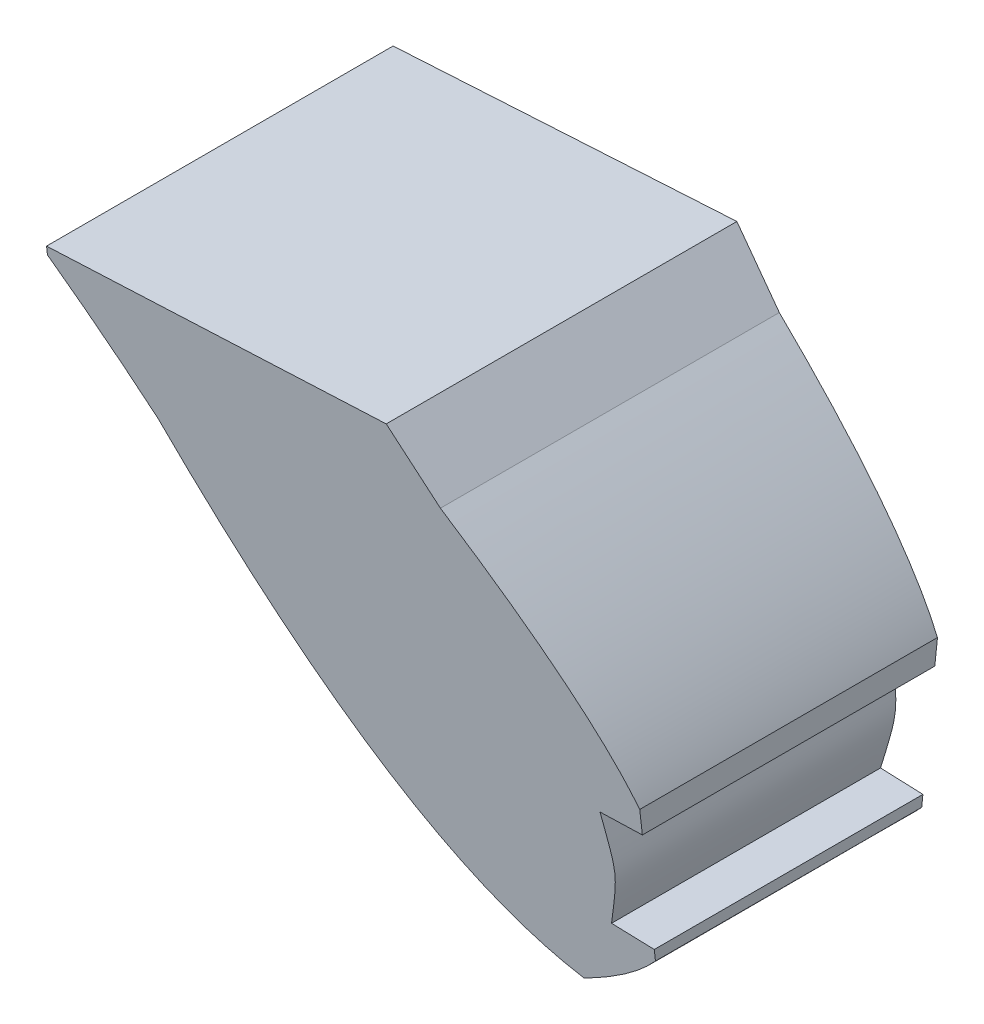
ISO-10303-21;
HEADER;
FILE_DESCRIPTION(('STEP AP214'),'2;1');
FILE_NAME('part.step','',(''),(''),'','','');
FILE_SCHEMA(('AUTOMOTIVE_DESIGN { 1 0 10303 214 1 1 1 1 }'));
ENDSEC;
DATA;
#1=APPLICATION_CONTEXT('core data for automotive mechanical design processes');
#2=APPLICATION_PROTOCOL_DEFINITION('international standard','automotive_design',2000,#1);
#3=PRODUCT_CONTEXT('',#1,'mechanical');
#4=PRODUCT('Part','Part','',(#3));
#5=PRODUCT_RELATED_PRODUCT_CATEGORY('part','',(#4));
#6=PRODUCT_DEFINITION_FORMATION('','',#4);
#7=PRODUCT_DEFINITION_CONTEXT('part definition',#1,'design');
#8=PRODUCT_DEFINITION('design','',#6,#7);
#9=PRODUCT_DEFINITION_SHAPE('','',#8);
#10=(LENGTH_UNIT() NAMED_UNIT(*) SI_UNIT(.MILLI.,.METRE.));
#11=(NAMED_UNIT(*) PLANE_ANGLE_UNIT() SI_UNIT($,.RADIAN.));
#12=(NAMED_UNIT(*) SI_UNIT($,.STERADIAN.) SOLID_ANGLE_UNIT());
#13=UNCERTAINTY_MEASURE_WITH_UNIT(LENGTH_MEASURE(1.E-05),#10,'distance_accuracy_value','');
#14=(GEOMETRIC_REPRESENTATION_CONTEXT(3) GLOBAL_UNCERTAINTY_ASSIGNED_CONTEXT((#13)) GLOBAL_UNIT_ASSIGNED_CONTEXT((#10,
#11,#12)) REPRESENTATION_CONTEXT('',''));
#15=CARTESIAN_POINT('',(0.,0.,0.));
#16=DIRECTION('',(0.,0.,1.));
#17=DIRECTION('',(1.,0.,0.));
#18=AXIS2_PLACEMENT_3D('',#15,#16,#17);
#19=CARTESIAN_POINT('',(0.355125000055651,-1.23774703808888E-13,7.21));
#20=DIRECTION('',(-1.,3.48538412642003E-13,0.));
#21=DIRECTION('',(-3.48538412642003E-13,-1.,0.));
#22=AXIS2_PLACEMENT_3D('',#19,#20,#21);
#23=PLANE('',#22);
#24=DIRECTION('',(0.,-0.993653373689782,0.112485434412262));
#25=VECTOR('',#24,1.);
#26=CARTESIAN_POINT('',(0.355125000056697,12.6081551722012,-7.21));
#27=LINE('',#26,#25);
#28=CARTESIAN_POINT('',(0.355125000056697,3.0015495286345,-6.12249480185305));
#29=VERTEX_POINT('',#28);
#30=CARTESIAN_POINT('',(0.355125000056447,2.03738091179555,-6.01334715682561));
#31=VERTEX_POINT('',#30);
#32=EDGE_CURVE('E58',#29,#31,#27,.T.);
#33=ORIENTED_EDGE('',*,*,#32,.F.);
#34=DIRECTION('',(0.,0.,-1.));
#35=VECTOR('',#34,1.);
#36=CARTESIAN_POINT('',(0.355125000056697,3.0015495286345,7.21));
#37=LINE('',#36,#35);
#38=CARTESIAN_POINT('',(0.355125000056697,3.0015495286345,6.12249480185305));
#39=VERTEX_POINT('',#38);
#40=EDGE_CURVE('E177',#39,#29,#37,.T.);
#41=ORIENTED_EDGE('',*,*,#40,.F.);
#42=DIRECTION('',(0.,0.993653373689782,0.112485434412263));
#43=VECTOR('',#42,1.);
#44=CARTESIAN_POINT('',(0.355125000056697,12.6081551722012,7.21));
#45=LINE('',#44,#43);
#46=CARTESIAN_POINT('',(0.355125000056697,2.03738091179556,6.01334715682562));
#47=VERTEX_POINT('',#46);
#48=EDGE_CURVE('E154',#47,#39,#45,.T.);
#49=ORIENTED_EDGE('',*,*,#48,.F.);
#50=DIRECTION('',(0.,0.,-1.));
#51=VECTOR('',#50,1.);
#52=CARTESIAN_POINT('',(0.355125000056447,2.03738091179555,7.21));
#53=LINE('',#52,#51);
#54=EDGE_CURVE('E171',#47,#31,#53,.T.);
#55=ORIENTED_EDGE('',*,*,#54,.T.);
#56=EDGE_LOOP('',(#33,#41,#49,#55));
#57=FACE_BOUND('',#56,.T.);
#58=ADVANCED_FACE('F43',(#57),#23,.F.);
#59=CARTESIAN_POINT('',(-23.0359211456035,0.,7.21));
#60=DIRECTION('',(-1.,0.,0.));
#61=DIRECTION('',(0.,0.,1.));
#62=AXIS2_PLACEMENT_3D('',#59,#60,#61);
#63=PLANE('',#62);
#64=DIRECTION('',(0.,0.,-1.));
#65=VECTOR('',#64,1.);
#66=CARTESIAN_POINT('',(-23.0359211456035,11.8716122879342,7.21));
#67=LINE('',#66,#65);
#68=CARTESIAN_POINT('',(-23.0359211456035,11.8716122879342,7.12662047501294));
#69=VERTEX_POINT('',#68);
#70=CARTESIAN_POINT('',(-23.0359211456035,11.8716122879342,-7.12662047501294));
#71=VERTEX_POINT('',#70);
#72=EDGE_CURVE('E188',#69,#71,#67,.T.);
#73=ORIENTED_EDGE('',*,*,#72,.T.);
#74=DIRECTION('',(0.,-0.993653373689782,0.112485434412262));
#75=VECTOR('',#74,1.);
#76=CARTESIAN_POINT('',(-23.0359211456035,12.6081551722012,-7.21));
#77=LINE('',#76,#75);
#78=CARTESIAN_POINT('',(-23.0359211456035,11.5401378200982,-7.08909627341673));
#79=VERTEX_POINT('',#78);
#80=EDGE_CURVE('E322',#71,#79,#77,.T.);
#81=ORIENTED_EDGE('',*,*,#80,.T.);
#82=DIRECTION('',(0.,0.,-1.));
#83=VECTOR('',#82,1.);
#84=CARTESIAN_POINT('',(-23.0359211456035,11.5401378200983,7.21));
#85=LINE('',#84,#83);
#86=CARTESIAN_POINT('',(-23.0359211456035,11.5401378200982,7.08909627341673));
#87=VERTEX_POINT('',#86);
#88=EDGE_CURVE('E194',#87,#79,#85,.T.);
#89=ORIENTED_EDGE('',*,*,#88,.F.);
#90=DIRECTION('',(0.,0.993653373689782,0.112485434412263));
#91=VECTOR('',#90,1.);
#92=CARTESIAN_POINT('',(-23.0359211456035,12.6081551722012,7.21));
#93=LINE('',#92,#91);
#94=EDGE_CURVE('E316',#87,#69,#93,.T.);
#95=ORIENTED_EDGE('',*,*,#94,.T.);
#96=EDGE_LOOP('',(#73,#81,#89,#95));
#97=FACE_BOUND('',#96,.T.);
#98=ADVANCED_FACE('F319',(#97),#63,.T.);
#99=CARTESIAN_POINT('',(-18.9451921135982,7.54091889574655,7.21));
#100=CARTESIAN_POINT('',(-10.2150083842792,-3.69764410322756,7.21));
#101=CARTESIAN_POINT('',(-2.84660482498738,-5.05908110388432,7.21));
#102=(BOUNDED_CURVE() B_SPLINE_CURVE(2,(#99,#100,#101),.UNSPECIFIED.,.F.,
.F.) B_SPLINE_CURVE_WITH_KNOTS((3,3),(0.497667241108509,0.499554279588011),
.UNSPECIFIED.) CURVE() GEOMETRIC_REPRESENTATION_ITEM() RATIONAL_B_SPLINE_CURVE((1.,1.,1.)) REPRESENTATION_ITEM(''));
#103=DIRECTION('',(0.,0.,-1.));
#104=VECTOR('',#103,1.);
#105=SURFACE_OF_LINEAR_EXTRUSION('',#102,#104);
#106=DIRECTION('',(0.,0.,-1.));
#107=VECTOR('',#106,1.);
#108=CARTESIAN_POINT('',(-18.9451921135982,7.54091889574657,7.21));
#109=LINE('',#108,#107);
#110=CARTESIAN_POINT('',(-18.9451921135982,7.54091889574657,6.63636910524442));
#111=VERTEX_POINT('',#110);
#112=CARTESIAN_POINT('',(-18.9451921135982,7.54091889574657,-6.63636910524442));
#113=VERTEX_POINT('',#112);
#114=EDGE_CURVE('E196',#111,#113,#109,.T.);
#115=ORIENTED_EDGE('',*,*,#114,.T.);
#116=CARTESIAN_POINT('',(-18.9451921135982,7.54091889574655,-6.63636910524441));
#117=CARTESIAN_POINT('',(-18.7033608655423,7.22962108931645,-6.60112898035273));
#118=CARTESIAN_POINT('',(-18.4592647140916,6.9200497206851,-6.56608429494821));
#119=CARTESIAN_POINT('',(-17.9661198805234,6.30464603742845,-6.49641819962467));
#120=CARTESIAN_POINT('',(-17.7170694462669,5.99881510969872,-6.46179694670763));
#121=CARTESIAN_POINT('',(-17.2137366178937,5.3913665824337,-6.39303140604553));
#122=CARTESIAN_POINT('',(-16.9594535947769,5.08974949683998,-6.35888717648066));
#123=CARTESIAN_POINT('',(-16.4451285665965,4.49103725761873,-6.29111061767257));
#124=CARTESIAN_POINT('',(-16.1850826962375,4.19394537928884,-6.25747865920581));
#125=CARTESIAN_POINT('',(-15.6590118901181,3.60508061675355,-6.1908168731366));
#126=CARTESIAN_POINT('',(-15.3929875534481,3.31330720485499,-6.15778698579723));
#127=CARTESIAN_POINT('',(-14.8544901847056,2.7357195544677,-6.09240181277285));
#128=CARTESIAN_POINT('',(-14.5820174931064,2.44990500284308,-6.06004649163963));
#129=CARTESIAN_POINT('',(-13.9777704357619,1.83142011947111,-5.99003159245484));
#130=CARTESIAN_POINT('',(-13.6445482479649,1.50014167377654,-5.95252958132897));
#131=CARTESIAN_POINT('',(-12.9673134934436,0.848664446736888,-5.87877982026176));
#132=CARTESIAN_POINT('',(-12.623301443116,0.528465136688492,-5.84253201046914));
#133=CARTESIAN_POINT('',(-11.9227759490938,-0.0995013958587513,-5.7714437516454));
#134=CARTESIAN_POINT('',(-11.5662405708663,-0.407244542107335,-5.73660602813964));
#135=CARTESIAN_POINT('',(-10.840142749037,-1.00720368374379,-5.66868831511867));
#136=CARTESIAN_POINT('',(-10.4705807273197,-1.29942018121482,-5.6356082687657));
#137=CARTESIAN_POINT('',(-9.71382699072171,-1.86779135556405,-5.57126643674768));
#138=CARTESIAN_POINT('',(-9.32650636654571,-2.14377746328672,-5.54002373376801));
#139=CARTESIAN_POINT('',(-8.5360986768139,-2.67282289543975,-5.48013372902864));
#140=CARTESIAN_POINT('',(-8.13300835344273,-2.92587744631612,-5.45148696765387));
#141=CARTESIAN_POINT('',(-7.31201826568453,-3.40280761684766,-5.39749661363601));
#142=CARTESIAN_POINT('',(-6.89419365451789,-3.62680992502778,-5.37213867935817));
#143=CARTESIAN_POINT('',(-6.04187322097519,-4.0405536088069,-5.32530128189388));
#144=CARTESIAN_POINT('',(-5.60738935372736,-4.23031901573022,-5.30381909826786));
#145=CARTESIAN_POINT('',(-4.78985442909107,-4.54236533838515,-5.26849423842238));
#146=CARTESIAN_POINT('',(-4.4091055725695,-4.67052923075731,-5.25398558631979));
#147=CARTESIAN_POINT('',(-3.82960691198316,-4.83674345690554,-5.23516948814227));
#148=CARTESIAN_POINT('',(-3.63462104960687,-4.8878904691115,-5.22937944702812));
#149=CARTESIAN_POINT('',(-3.24229120544362,-4.9807402777546,-5.21886848683127));
#150=CARTESIAN_POINT('',(-3.0449461414238,-5.02243854990591,-5.21414807991536));
#151=CARTESIAN_POINT('',(-2.84660482498738,-5.05908110388432,-5.21));
#152=B_SPLINE_CURVE_WITH_KNOTS('',3,(#116,#117,#118,#119,#120,#121,#122,#123,#124,#125,#126,
#127,#128,#129,#130,#131,#132,#133,#134,#135,#136,#137,#138,#139,#140,#141,#142,#143,#144,#145,
#146,#147,#148,#149,#150,#151),.UNSPECIFIED.,.F.,.F.,(4,2,2,2,2,2,2,2,2,2,2,2,2,2,2,2,2,4),(0.,
1.1872997216569,2.37502708567824,3.56289806807204,4.75159146291787,5.9401662676152,
7.12867845491363,8.54255640265696,9.95636678593971,11.3727907462706,12.7891688759803,
14.2183172044781,15.6477623519031,17.0707480146133,18.4927309460623,19.6971402338765,
20.3019233237111,20.9069953892921),.UNSPECIFIED.);
#153=CARTESIAN_POINT('',(-2.84660482498738,-5.05908110388432,-5.21));
#154=VERTEX_POINT('',#153);
#155=EDGE_CURVE('E257',#113,#154,#152,.T.);
#156=ORIENTED_EDGE('',*,*,#155,.T.);
#157=DIRECTION('',(0.,0.,-1.));
#158=VECTOR('',#157,1.);
#159=CARTESIAN_POINT('',(-2.84660482498738,-5.05908110388432,7.21));
#160=LINE('',#159,#158);
#161=CARTESIAN_POINT('',(-2.84660482498738,-5.05908110388432,5.21));
#162=VERTEX_POINT('',#161);
#163=EDGE_CURVE('E157',#162,#154,#160,.T.);
#164=ORIENTED_EDGE('',*,*,#163,.F.);
#165=CARTESIAN_POINT('',(-2.84660482498738,-5.05908110388432,5.21));
#166=CARTESIAN_POINT('',(-3.0836355452615,-5.01529762547054,5.21495646039138));
#167=CARTESIAN_POINT('',(-3.31925014057108,-4.96428184629726,5.22073164541478));
#168=CARTESIAN_POINT('',(-3.78628189704186,-4.84911384389608,5.23376911212451));
#169=CARTESIAN_POINT('',(-4.01771143135529,-4.78501130060695,5.24102576984815));
#170=CARTESIAN_POINT('',(-4.47638324853452,-4.64477679089168,5.25690086287615));
#171=CARTESIAN_POINT('',(-4.70363211310206,-4.56866593727755,5.26551690812791));
#172=CARTESIAN_POINT('',(-5.1539801611568,-4.40545252874729,5.28399330205617));
#173=CARTESIAN_POINT('',(-5.37708095327682,-4.31835434125152,5.29385315632366));
#174=CARTESIAN_POINT('',(-5.81545834234536,-4.13567110279715,5.31453361087802));
#175=CARTESIAN_POINT('',(-6.03080317783365,-4.04024711994086,5.32533597762798));
#176=CARTESIAN_POINT('',(-6.45748946905634,-3.84057736608456,5.34793937192645));
#177=CARTESIAN_POINT('',(-6.66882789943329,-3.73632522989765,5.35974112003892));
#178=CARTESIAN_POINT('',(-7.08747417766979,-3.51983158147829,5.38424904476877));
#179=CARTESIAN_POINT('',(-7.29477947597257,-3.40758521204135,5.39695577124062));
#180=CARTESIAN_POINT('',(-7.70530843131035,-3.17590609220346,5.42318275051655));
#181=CARTESIAN_POINT('',(-7.90853147430462,-3.0564722713248,5.43670312450288));
#182=CARTESIAN_POINT('',(-8.45410340689061,-2.72385368196738,5.47435684511425));
#183=CARTESIAN_POINT('',(-8.79259906035209,-2.50440768840731,5.49919898682003));
#184=CARTESIAN_POINT('',(-9.45845448583479,-2.04949644973372,5.5506967119384));
#185=CARTESIAN_POINT('',(-9.78581359629267,-1.81403025542841,5.5773524028032));
#186=CARTESIAN_POINT('',(-10.4302582396863,-1.32938575303013,5.63221604925302));
#187=CARTESIAN_POINT('',(-10.7473396395034,-1.08020203459831,5.66042461730948));
#188=CARTESIAN_POINT('',(-11.3718438106499,-0.570176876647104,5.71816145288252));
#189=CARTESIAN_POINT('',(-11.6792662750814,-0.309335067346119,5.74768976225981));
#190=CARTESIAN_POINT('',(-12.2887351366992,0.225514030316342,5.80823676455314));
#191=CARTESIAN_POINT('',(-12.5906756597182,0.499640146613562,5.83926890925461));
#192=CARTESIAN_POINT('',(-13.1859914625247,1.05668157973797,5.90232817041119));
#193=CARTESIAN_POINT('',(-13.4793699933214,1.33959347409339,5.93435489942917));
#194=CARTESIAN_POINT('',(-14.0582984741035,1.91313890151101,5.99928247705986));
#195=CARTESIAN_POINT('',(-14.3438493181123,2.20377154523463,6.03218322499598));
#196=CARTESIAN_POINT('',(-14.9077244427009,2.7918210558895,6.09875272137508));
#197=CARTESIAN_POINT('',(-15.1860493084316,3.08923736980037,6.13242140721399));
#198=CARTESIAN_POINT('',(-15.7683607406539,3.72540309630891,6.20443784674841));
#199=CARTESIAN_POINT('',(-16.0715178451228,4.06490144250158,6.24287038264565));
#200=CARTESIAN_POINT('',(-16.6701836985208,4.7504922746204,6.32048193675692));
#201=CARTESIAN_POINT('',(-16.9656923307507,5.09658486102068,6.35966096634501));
#202=CARTESIAN_POINT('',(-17.4495199616275,5.67490501691598,6.42512906184765));
#203=CARTESIAN_POINT('',(-17.6398456690967,5.90547984199544,6.45123103065322));
#204=CARTESIAN_POINT('',(-18.0176052393411,6.36895711711416,6.50369846448112));
#205=CARTESIAN_POINT('',(-18.205039097963,6.60185957049552,6.5300639298818));
#206=CARTESIAN_POINT('',(-18.5771476687389,7.06981539005112,6.58303835239394));
#207=CARTESIAN_POINT('',(-18.7618224957771,7.30486866600559,6.60964729929217));
#208=CARTESIAN_POINT('',(-18.9451921135982,7.54091889574655,6.63636910524441));
#209=B_SPLINE_CURVE_WITH_KNOTS('',3,(#165,#166,#167,#168,#169,#170,#171,#172,#173,#174,#175,
#176,#177,#178,#179,#180,#181,#182,#183,#184,#185,#186,#187,#188,#189,#190,#191,#192,#193,#194,
#195,#196,#197,#198,#199,#200,#201,#202,#203,#204,#205,#206,#207,#208),.UNSPECIFIED.,.F.,.F.,(4,
2,2,2,2,2,2,2,2,2,2,2,2,2,2,2,2,2,2,2,2,4),(0.,0.723070627629283,1.44344574109941,
2.16256813451498,2.88140557514503,3.58855192345824,4.2962125448096,5.0043068623572,
5.71250690363926,6.92441762508089,8.13640021448464,9.3488642962315,10.5613668633146,
11.788141520998,13.0144441434254,14.2406061176645,15.4666684871313,16.8368576095009,
18.2070676256843,19.1073954524656,20.0077245721621,20.9080160976373),.UNSPECIFIED.);
#210=EDGE_CURVE('E139',#162,#111,#209,.T.);
#211=ORIENTED_EDGE('',*,*,#210,.T.);
#212=EDGE_LOOP('',(#115,#156,#164,#211));
#213=FACE_BOUND('',#212,.T.);
#214=ADVANCED_FACE('F44',(#213),#105,.F.);
#215=CARTESIAN_POINT('',(-2.84660482498738,-5.05908110388432,7.21));
#216=CARTESIAN_POINT('',(-0.742366881974002,-3.93520659958673,7.21));
#217=CARTESIAN_POINT('',(0.355124999965198,-2.72325322699678,7.21));
#218=(BOUNDED_CURVE() B_SPLINE_CURVE(2,(#215,#216,#217),.UNSPECIFIED.,.F.,
.F.) B_SPLINE_CURVE_WITH_KNOTS((3,3),(0.498812074629495,0.499412845463797),
.UNSPECIFIED.) CURVE() GEOMETRIC_REPRESENTATION_ITEM() RATIONAL_B_SPLINE_CURVE((1.,1.,1.)) REPRESENTATION_ITEM(''));
#219=DIRECTION('',(0.,0.,-1.));
#220=VECTOR('',#219,1.);
#221=SURFACE_OF_LINEAR_EXTRUSION('',#218,#220);
#222=ORIENTED_EDGE('',*,*,#163,.T.);
#223=CARTESIAN_POINT('',(-2.84660482498738,-5.05908110388432,-5.21));
#224=CARTESIAN_POINT('',(-2.67154367534484,-4.96554243060771,-5.22058894235803));
#225=CARTESIAN_POINT('',(-2.49778385523126,-4.86952307483158,-5.23145870764284));
#226=CARTESIAN_POINT('',(-2.15332890723938,-4.67164155861341,-5.25385966647148));
#227=CARTESIAN_POINT('',(-1.9826387176766,-4.56977092703724,-5.26539181898071));
#228=CARTESIAN_POINT('',(-1.64527137465746,-4.35955519460265,-5.2891890591545));
#229=CARTESIAN_POINT('',(-1.47859514121983,-4.25120862887406,-5.30145431264808));
#230=CARTESIAN_POINT('',(-1.15044448784201,-4.02724001195876,-5.32680843294344));
#231=CARTESIAN_POINT('',(-0.98896568487432,-3.911624347545,-5.33989657673763));
#232=CARTESIAN_POINT('',(-0.724614348138144,-3.7114805449727,-5.36255363519824));
#233=CARTESIAN_POINT('',(-0.619967455079453,-3.6292658395869,-5.37186066025876));
#234=CARTESIAN_POINT('',(-0.414118763296717,-3.46070156785231,-5.39094279275538));
#235=CARTESIAN_POINT('',(-0.312916415666604,-3.3743526656372,-5.40071782500895));
#236=CARTESIAN_POINT('',(-0.114288127047668,-3.19685300163986,-5.42081147873311));
#237=CARTESIAN_POINT('',(-0.0168745915935634,-3.10568844995875,-5.43113166127401));
#238=CARTESIAN_POINT('',(0.173044677325634,-2.91833195578561,-5.45234114658855));
#239=CARTESIAN_POINT('',(0.265547074526193,-2.82213668167119,-5.46323082651485));
#240=CARTESIAN_POINT('',(0.355124999965198,-2.72325322699678,-5.47442481895704));
#241=B_SPLINE_CURVE_WITH_KNOTS('',3,(#223,#224,#225,#226,#227,#228,#229,#230,#231,#232,#233,
#234,#235,#236,#237,#238,#239,#240),.UNSPECIFIED.,.F.,.F.,(4,2,2,2,2,2,2,2,4),(0.,
0.596333361221147,1.19355295493407,1.79090815604603,2.38774565156578,2.78786762990545,
3.18792554534165,3.58919872466333,3.99074110013676),.UNSPECIFIED.);
#242=CARTESIAN_POINT('',(0.355125000010947,-2.72325322699678,-5.47442481895703));
#243=VERTEX_POINT('',#242);
#244=EDGE_CURVE('E160',#154,#243,#241,.T.);
#245=ORIENTED_EDGE('',*,*,#244,.T.);
#246=DIRECTION('',(0.,0.,-1.));
#247=VECTOR('',#246,1.);
#248=CARTESIAN_POINT('',(0.355124999965198,-2.72325322699678,7.21));
#249=LINE('',#248,#247);
#250=CARTESIAN_POINT('',(0.355125000010947,-2.72325322699678,5.47442481895703));
#251=VERTEX_POINT('',#250);
#252=EDGE_CURVE('E146',#251,#243,#249,.T.);
#253=ORIENTED_EDGE('',*,*,#252,.F.);
#254=CARTESIAN_POINT('',(0.355124999965198,-2.72325322699678,5.47442481895703));
#255=CARTESIAN_POINT('',(0.288265800066398,-2.79707578870119,5.46606781726749));
#256=CARTESIAN_POINT('',(0.219762299322532,-2.86939557158838,5.45788093599675));
#257=CARTESIAN_POINT('',(0.0798741499126208,-3.0111837154317,5.44182996553056));
#258=CARTESIAN_POINT('',(0.00849051694650479,-3.08065306448068,5.43396576447915));
#259=CARTESIAN_POINT('',(-0.209110404202349,-3.28478130911614,5.41085765164865));
#260=CARTESIAN_POINT('',(-0.359086186155244,-3.41549544786354,5.39606030171743));
#261=CARTESIAN_POINT('',(-0.666431647279958,-3.66745151891472,5.36753789253992));
#262=CARTESIAN_POINT('',(-0.823790135326829,-3.78870709059741,5.35381128926277));
#263=CARTESIAN_POINT('',(-1.14463764434189,-4.02329424679429,5.32725510893767));
#264=CARTESIAN_POINT('',(-1.30813354467851,-4.13661650521983,5.31442658763929));
#265=CARTESIAN_POINT('',(-1.58497175174893,-4.31986712055689,5.29368190381061));
#266=CARTESIAN_POINT('',(-1.69701528140079,-4.39175032218513,5.28554444523986));
#267=CARTESIAN_POINT('',(-1.92294333828473,-4.53261962763427,5.26959749086083));
#268=CARTESIAN_POINT('',(-2.03682799400811,-4.6016055280346,5.26178801808056));
#269=CARTESIAN_POINT('',(-2.26591352019373,-4.73675126913538,5.24648899349189));
#270=CARTESIAN_POINT('',(-2.38111062922232,-4.80291742324192,5.23899872698133));
#271=CARTESIAN_POINT('',(-2.6128736149529,-4.93278949726635,5.22429670205848));
#272=CARTESIAN_POINT('',(-2.72943923096306,-4.99649587614853,5.21708489168965));
#273=CARTESIAN_POINT('',(-2.84660482498738,-5.05908110388432,5.21));
#274=B_SPLINE_CURVE_WITH_KNOTS('',3,(#254,#255,#256,#257,#258,#259,#260,#261,#262,#263,#264,
#265,#266,#267,#268,#269,#270,#271,#272,#273),.UNSPECIFIED.,.F.,.F.,(4,2,2,2,2,2,2,2,2,4),(0.,
0.299782926841572,0.599461041577767,1.1974499434567,1.79455995327913,2.39236050766276,
2.79242459253001,3.19251671924541,3.59166012626068,3.99072869445439),.UNSPECIFIED.);
#275=EDGE_CURVE('E131',#251,#162,#274,.T.);
#276=ORIENTED_EDGE('',*,*,#275,.T.);
#277=EDGE_LOOP('',(#222,#245,#253,#276));
#278=FACE_BOUND('',#277,.T.);
#279=ADVANCED_FACE('F156',(#278),#221,.F.);
#280=CARTESIAN_POINT('',(0.355125000532009,-7.39148800447813E-11,7.21));
#281=DIRECTION('',(1.,-2.08137641489758E-10,0.));
#282=DIRECTION('',(2.08137641489758E-10,1.,0.));
#283=AXIS2_PLACEMENT_3D('',#280,#281,#282);
#284=PLANE('',#283);
#285=CARTESIAN_POINT('',(0.355125000056697,-2.28484178142546,-5.52405470319249));
#286=VERTEX_POINT('',#285);
#287=EDGE_CURVE('E152',#286,#243,#27,.T.);
#288=ORIENTED_EDGE('',*,*,#287,.F.);
#289=DIRECTION('',(0.,0.,-1.));
#290=VECTOR('',#289,1.);
#291=CARTESIAN_POINT('',(0.355125000056447,-2.28484178142545,7.21));
#292=LINE('',#291,#290);
#293=CARTESIAN_POINT('',(0.355125000056697,-2.28484178142546,5.52405470319249));
#294=VERTEX_POINT('',#293);
#295=EDGE_CURVE('E151',#294,#286,#292,.T.);
#296=ORIENTED_EDGE('',*,*,#295,.F.);
#297=EDGE_CURVE('E133',#251,#294,#45,.T.);
#298=ORIENTED_EDGE('',*,*,#297,.F.);
#299=ORIENTED_EDGE('',*,*,#252,.T.);
#300=EDGE_LOOP('',(#288,#296,#298,#299));
#301=FACE_BOUND('',#300,.T.);
#302=ADVANCED_FACE('F149',(#301),#284,.T.);
#303=CARTESIAN_POINT('',(-0.0792587195419091,-2.26967276768239,7.21));
#304=DIRECTION('',(-0.0348994967024901,-0.999390827019096,0.));
#305=DIRECTION('',(0.999390827019096,-0.0348994967024901,0.));
#306=AXIS2_PLACEMENT_3D('',#303,#304,#305);
#307=PLANE('',#306);
#308=ORIENTED_EDGE('',*,*,#295,.T.);
#309=DIRECTION('',(-0.999383027616045,0.034899224341334,-0.00395072820626436));
#310=VECTOR('',#309,1.);
#311=CARTESIAN_POINT('',(-0.0289741896082848,-2.2714287421612,-5.52557311151111));
#312=LINE('',#311,#310);
#313=CARTESIAN_POINT('',(-1.39487499994356,-2.22373043481491,-5.5309727457947));
#314=VERTEX_POINT('',#313);
#315=EDGE_CURVE('E305',#286,#314,#312,.T.);
#316=ORIENTED_EDGE('',*,*,#315,.T.);
#317=DIRECTION('',(0.,0.,-1.));
#318=VECTOR('',#317,1.);
#319=CARTESIAN_POINT('',(-1.39487499994356,-2.22373043481491,7.21));
#320=LINE('',#319,#318);
#321=CARTESIAN_POINT('',(-1.39487499994356,-2.22373043481491,5.5309727457947));
#322=VERTEX_POINT('',#321);
#323=EDGE_CURVE('E163',#322,#314,#320,.T.);
#324=ORIENTED_EDGE('',*,*,#323,.F.);
#325=DIRECTION('',(0.999383027616045,-0.034899224341334,-0.00395072820626436));
#326=VECTOR('',#325,1.);
#327=CARTESIAN_POINT('',(-0.0859085417339361,-2.26944055077446,5.52579818252456));
#328=LINE('',#327,#326);
#329=EDGE_CURVE('E321',#322,#294,#328,.T.);
#330=ORIENTED_EDGE('',*,*,#329,.T.);
#331=EDGE_LOOP('',(#308,#316,#324,#330));
#332=FACE_BOUND('',#331,.T.);
#333=ADVANCED_FACE('F331',(#332),#307,.F.);
#334=CARTESIAN_POINT('',(-1.39487499994356,-2.22373043481491,7.21));
#335=CARTESIAN_POINT('',(-0.907530669798052,-0.123730434814926,7.21));
#336=CARTESIAN_POINT('',(-1.39487499994356,1.976269565185,7.21));
#337=(BOUNDED_CURVE() B_SPLINE_CURVE(2,(#334,#335,#336),.UNSPECIFIED.,.F.,
.F.) B_SPLINE_CURVE_WITH_KNOTS((3,3),(0.,1.),
.UNSPECIFIED.) CURVE() GEOMETRIC_REPRESENTATION_ITEM() RATIONAL_B_SPLINE_CURVE((1.,
3.23180121851367,1.)) REPRESENTATION_ITEM(''));
#338=DIRECTION('',(0.,0.,-1.));
#339=VECTOR('',#338,1.);
#340=SURFACE_OF_LINEAR_EXTRUSION('',#337,#339);
#341=ORIENTED_EDGE('',*,*,#323,.T.);
#342=CARTESIAN_POINT('',(-1.39487499994356,-2.22373043481491,-5.5309727457947));
#343=CARTESIAN_POINT('',(-1.38202447122813,-2.16835021356968,-5.53724200266994));
#344=CARTESIAN_POINT('',(-1.36921744547373,-2.11295996104296,-5.54351239512535));
#345=CARTESIAN_POINT('',(-1.34371955909939,-2.00215267308472,-5.55605621196536));
#346=CARTESIAN_POINT('',(-1.33102869927897,-1.94673563747162,-5.56232963637053));
#347=CARTESIAN_POINT('',(-1.30579250980865,-1.83586894873068,-5.57488017761064));
#348=CARTESIAN_POINT('',(-1.29324717983284,-1.78041929567618,-5.58115729443729));
#349=CARTESIAN_POINT('',(-1.26834035470031,-1.66945670178657,-5.593718692514));
#350=CARTESIAN_POINT('',(-1.25597893242913,-1.61394374477822,-5.60000297559494));
#351=CARTESIAN_POINT('',(-1.23150428056634,-1.50286329328951,-5.61257771561119));
#352=CARTESIAN_POINT('',(-1.21939105277074,-1.44729579841754,-5.61886817259083));
#353=CARTESIAN_POINT('',(-1.19550012207595,-1.33608743052918,-5.63145739324204));
#354=CARTESIAN_POINT('',(-1.1837224309966,-1.2804465549999,-5.63775615719808));
#355=CARTESIAN_POINT('',(-1.15485704104805,-1.14125615214793,-5.65351305326002));
#356=CARTESIAN_POINT('',(-1.13805530724695,-1.05764770999797,-5.66297785475397));
#357=CARTESIAN_POINT('',(-1.10616760722362,-0.890046794372652,-5.68195093158457));
#358=CARTESIAN_POINT('',(-1.09108267359643,-0.806054121054038,-5.69145922954426));
#359=CARTESIAN_POINT('',(-1.06839764881353,-0.664871544058104,-5.70744164748329));
#360=CARTESIAN_POINT('',(-1.05995626751594,-0.607817685780514,-5.71390036659317));
#361=CARTESIAN_POINT('',(-1.04516806244473,-0.493450404650502,-5.72684718853439));
#362=CARTESIAN_POINT('',(-1.03882061818002,-0.436137063802354,-5.73333528208253));
#363=CARTESIAN_POINT('',(-1.02903068414648,-0.321308074689071,-5.74633437116685));
#364=CARTESIAN_POINT('',(-1.02558541499307,-0.263792673078833,-5.75284533878074));
#365=CARTESIAN_POINT('',(-1.02222407231355,-0.148714957691158,-5.76587258464867));
#366=CARTESIAN_POINT('',(-1.02230420900467,-0.0911527608046732,-5.7723888496702));
#367=CARTESIAN_POINT('',(-1.02596900528622,0.0239015023985966,-5.78541344065945));
#368=CARTESIAN_POINT('',(-1.02955657044098,0.0813934710005595,-5.79192175556548));
#369=CARTESIAN_POINT('',(-1.03959132289802,0.196133385303809,-5.80491076103416));
#370=CARTESIAN_POINT('',(-1.04603929917214,0.253381259276288,-5.81139144347683));
#371=CARTESIAN_POINT('',(-1.05997220439613,0.35983137212623,-5.8234420111136));
#372=CARTESIAN_POINT('',(-1.06719667195452,0.409068491171902,-5.82901584487869));
#373=CARTESIAN_POINT('',(-1.08274764683563,0.507347946837772,-5.84014146227917));
#374=CARTESIAN_POINT('',(-1.0910737056158,0.556390354412903,-5.84569325394695));
#375=CARTESIAN_POINT('',(-1.10853037258208,0.654424381213791,-5.85679108784343));
#376=CARTESIAN_POINT('',(-1.11766242226862,0.70341574413319,-5.86233710105725));
#377=CARTESIAN_POINT('',(-1.1364977866421,0.801294033672846,-5.8734173048888));
#378=CARTESIAN_POINT('',(-1.14620115522269,0.850180949988233,-5.87895149433999));
#379=CARTESIAN_POINT('',(-1.16833495400599,0.959258362431623,-5.89129948252998));
#380=CARTESIAN_POINT('',(-1.1808737668477,1.01942705832357,-5.89811081339709));
#381=CARTESIAN_POINT('',(-1.20639174214038,1.13967062360228,-5.91172285360527));
#382=CARTESIAN_POINT('',(-1.21937089694786,1.19974549459873,-5.91852356312855));
#383=CARTESIAN_POINT('',(-1.24564626429316,1.31982703510014,-5.93211726150049));
#384=CARTESIAN_POINT('',(-1.2589424791072,1.37983370411223,-5.93891025029334));
#385=CARTESIAN_POINT('',(-1.28569888355067,1.49948275843749,-5.95245498954463));
#386=CARTESIAN_POINT('',(-1.29915785770072,1.55912541262012,-5.95920677044014));
#387=CARTESIAN_POINT('',(-1.32625009614692,1.67837055204035,-5.97270578495002));
#388=CARTESIAN_POINT('',(-1.33988335761136,1.73797303791406,-5.97945301863641));
#389=CARTESIAN_POINT('',(-1.36728618039678,1.85714403003134,-5.99294363938264));
#390=CARTESIAN_POINT('',(-1.381055735056,1.91671253778666,-5.9996870266136));
#391=CARTESIAN_POINT('',(-1.39487499994356,1.976269565185,-6.00642911422342));
#392=B_SPLINE_CURVE_WITH_KNOTS('',3,(#342,#343,#344,#345,#346,#347,#348,#349,#350,#351,#352,
#353,#354,#355,#356,#357,#358,#359,#360,#361,#362,#363,#364,#365,#366,#367,#368,#369,#370,#371,
#372,#373,#374,#375,#376,#377,#378,#379,#380,#381,#382,#383,#384,#385,#386,#387,#388,#389,#390,
#391),.UNSPECIFIED.,.F.,.F.,(4,2,2,2,2,2,2,2,2,2,2,2,2,2,2,2,2,2,2,2,2,2,2,2,4),(0.,
0.171588763273453,0.343178706622211,0.514768265617104,0.686424107910212,0.858081191922478,
1.02974431538338,1.28714724145325,1.54470417716685,1.71878537631805,1.8928149439917,
2.06667765516018,2.24035346989174,2.41417328020677,2.58804106414591,2.73825198714263,
2.88840193486919,3.03882608638502,3.18926445051695,3.37477476712053,3.56028186526787,
3.74579029559563,3.93033206952695,4.11487084894101,4.29940065253389),.UNSPECIFIED.);
#393=CARTESIAN_POINT('',(-1.39487499994356,1.976269565185,-6.00642911422342));
#394=VERTEX_POINT('',#393);
#395=EDGE_CURVE('E178',#314,#394,#392,.T.);
#396=ORIENTED_EDGE('',*,*,#395,.T.);
#397=DIRECTION('',(0.,0.,-1.));
#398=VECTOR('',#397,1.);
#399=CARTESIAN_POINT('',(-1.39487499994356,1.976269565185,7.21));
#400=LINE('',#399,#398);
#401=CARTESIAN_POINT('',(-1.39487499994356,1.976269565185,6.00642911422342));
#402=VERTEX_POINT('',#401);
#403=EDGE_CURVE('E169',#402,#394,#400,.T.);
#404=ORIENTED_EDGE('',*,*,#403,.F.);
#405=CARTESIAN_POINT('',(-1.39487499994356,1.976269565185,6.00642911422342));
#406=CARTESIAN_POINT('',(-1.37907511533365,1.90817072448153,5.99872006005792));
#407=CARTESIAN_POINT('',(-1.36333836969219,1.84005724657732,5.99100934890426));
#408=CARTESIAN_POINT('',(-1.33204781411177,1.703774616767,5.97558162408294));
#409=CARTESIAN_POINT('',(-1.31649404111311,1.63560545649229,5.96786460946793));
#410=CARTESIAN_POINT('',(-1.28563112684324,1.49920642241426,5.95242370722985));
#411=CARTESIAN_POINT('',(-1.27032200601989,1.43097654403409,5.94469981908867));
#412=CARTESIAN_POINT('',(-1.2399275173513,1.29390485970128,5.92918277022027));
#413=CARTESIAN_POINT('',(-1.22484485449072,1.22506245970345,5.92138954224482));
#414=CARTESIAN_POINT('',(-1.19518112320204,1.0872751663326,5.90579148364441));
#415=CARTESIAN_POINT('',(-1.18060002365467,1.01833027959621,5.89798665377074));
#416=CARTESIAN_POINT('',(-1.1521828568661,0.880291295746957,5.88236010282727));
#417=CARTESIAN_POINT('',(-1.13834675067045,0.81119720663251,5.87453838266293));
#418=CARTESIAN_POINT('',(-1.11516473949854,0.690174385789182,5.86083812768789));
#419=CARTESIAN_POINT('',(-1.10556404533104,0.638294159941606,5.85496508393199));
#420=CARTESIAN_POINT('',(-1.08728934318226,0.534373551286744,5.8432008660282));
#421=CARTESIAN_POINT('',(-1.07861528667302,0.482333177013413,5.83730969284637));
#422=CARTESIAN_POINT('',(-1.06260440200736,0.378149691610768,5.82551571627023));
#423=CARTESIAN_POINT('',(-1.05526500549272,0.326006977236309,5.81961295779011));
#424=CARTESIAN_POINT('',(-1.04244257361275,0.221494061638693,5.80778168843203));
#425=CARTESIAN_POINT('',(-1.03695934618146,0.169123884520429,5.80185318028283));
#426=CARTESIAN_POINT('',(-1.02917052981484,0.0729301509045451,5.79096367474698));
#427=CARTESIAN_POINT('',(-1.02648754730517,0.029137538921467,5.78600618039996));
#428=CARTESIAN_POINT('',(-1.02311803398459,-0.0585228047861233,5.77608268785843));
#429=CARTESIAN_POINT('',(-1.02243133042271,-0.10239052968188,5.77111669043696));
#430=CARTESIAN_POINT('',(-1.02313587995194,-0.190112899664058,5.76118617627941));
#431=CARTESIAN_POINT('',(-1.02452732528276,-0.233967543165022,5.75622165972282));
#432=CARTESIAN_POINT('',(-1.02922830316647,-0.321575626235211,5.74630408328911));
#433=CARTESIAN_POINT('',(-1.03253802615093,-0.365329055323648,5.74135102459847));
#434=CARTESIAN_POINT('',(-1.04481913269156,-0.496026010219698,5.72655561994619));
#435=CARTESIAN_POINT('',(-1.05614963950478,-0.582745183351363,5.71673867158183));
#436=CARTESIAN_POINT('',(-1.08246686740171,-0.755641929816293,5.69716608606103));
#437=CARTESIAN_POINT('',(-1.09745579058543,-0.84181914476287,5.68741048947536));
#438=CARTESIAN_POINT('',(-1.129420439335,-1.01366509487317,5.66795685819712));
#439=CARTESIAN_POINT('',(-1.14639302616418,-1.09933441387988,5.65825875741124));
#440=CARTESIAN_POINT('',(-1.18149622255001,-1.27039766561497,5.63889373063944));
#441=CARTESIAN_POINT('',(-1.19962634896168,-1.35579169781193,5.62922679339328));
#442=CARTESIAN_POINT('',(-1.24641099322308,-1.57177275123237,5.60477689641502));
#443=CARTESIAN_POINT('',(-1.2755379218154,-1.70225834502177,5.59000541866374));
#444=CARTESIAN_POINT('',(-1.31987060164556,-1.89787014932725,5.56786140006925));
#445=CARTESIAN_POINT('',(-1.33475842772637,-1.96306843680887,5.56048069983263));
#446=CARTESIAN_POINT('',(-1.36470186719661,-2.09342597092531,5.54572371893541));
#447=CARTESIAN_POINT('',(-1.37975747811874,-2.15858521811941,5.53834743821149));
#448=CARTESIAN_POINT('',(-1.39487499994356,-2.22373043481491,5.5309727457947));
#449=B_SPLINE_CURVE_WITH_KNOTS('',3,(#405,#406,#407,#408,#409,#410,#411,#412,#413,#414,#415,
#416,#417,#418,#419,#420,#421,#422,#423,#424,#425,#426,#427,#428,#429,#430,#431,#432,#433,#434,
#435,#436,#437,#438,#439,#440,#441,#442,#443,#444,#445,#446,#447,#448),.UNSPECIFIED.,.F.,.F.,(4,
2,2,2,2,2,2,2,2,2,2,2,2,2,2,2,2,2,2,2,2,4),(0.,0.210994688118994,0.422031267037357,
0.633085392962154,0.845798629208893,1.05849864386888,1.27118752598179,1.4304428147189,
1.58968975917224,1.7486269361582,1.90754766218714,2.03996993828288,2.1723807546786,
2.3048038205294,2.43724003455642,2.70109168787962,2.96510255404671,3.22870119353186,
3.49219051999256,3.89571487778355,4.09756249770236,4.29940715332609),.UNSPECIFIED.);
#450=EDGE_CURVE('E67',#402,#322,#449,.T.);
#451=ORIENTED_EDGE('',*,*,#450,.T.);
#452=EDGE_LOOP('',(#341,#396,#404,#451));
#453=FACE_BOUND('',#452,.T.);
#454=ADVANCED_FACE('F176',(#453),#340,.F.);
#455=CARTESIAN_POINT('',(0.355125000056697,3.0015495286345,7.21));
#456=CARTESIAN_POINT('',(-1.44872627004384,6.0584273141466,7.21));
#457=CARTESIAN_POINT('',(-6.99487502582887,10.4773899922143,7.21));
#458=(BOUNDED_CURVE() B_SPLINE_CURVE(2,(#455,#456,#457),.UNSPECIFIED.,.F.,
.F.) B_SPLINE_CURVE_WITH_KNOTS((3,3),(0.500820705122982,0.502013311782223),
.UNSPECIFIED.) CURVE() GEOMETRIC_REPRESENTATION_ITEM() RATIONAL_B_SPLINE_CURVE((1.,1.,1.)) REPRESENTATION_ITEM(''));
#459=DIRECTION('',(0.,0.,-1.));
#460=VECTOR('',#459,1.);
#461=SURFACE_OF_LINEAR_EXTRUSION('',#458,#460);
#462=ORIENTED_EDGE('',*,*,#40,.T.);
#463=CARTESIAN_POINT('',(0.355125000056697,3.0015495286345,-6.12249480185305));
#464=CARTESIAN_POINT('',(0.304611825062614,3.08713910892722,-6.13218387590574));
#465=CARTESIAN_POINT('',(0.252829574975965,3.17197675667729,-6.14178782826414));
#466=CARTESIAN_POINT('',(0.146996425684332,3.34022678950728,-6.16083438769209));
#467=CARTESIAN_POINT('',(0.0929458709863076,3.42363938833331,-6.17027701895852));
#468=CARTESIAN_POINT('',(-0.0720259816016994,3.67159280703978,-6.1983463122913));
#469=CARTESIAN_POINT('',(-0.185954424573863,3.83416207979728,-6.21674978753973));
#470=CARTESIAN_POINT('',(-0.420195702371685,4.15456473361426,-6.25302061663943));
#471=CARTESIAN_POINT('',(-0.540506139916056,4.3123998585806,-6.27088816790776));
#472=CARTESIAN_POINT('',(-0.785880610008438,4.62328354155297,-6.30608141241009));
#473=CARTESIAN_POINT('',(-0.910922246407595,4.77634960365364,-6.32340908717582));
#474=CARTESIAN_POINT('',(-1.16542402575789,5.0789091469452,-6.35766000662507));
#475=CARTESIAN_POINT('',(-1.29488601263671,5.22840109188721,-6.37458307739923));
#476=CARTESIAN_POINT('',(-1.55752786665308,5.52415387167798,-6.40806344469258));
#477=CARTESIAN_POINT('',(-1.6907082385264,5.67041426299934,-6.42462069100275));
#478=CARTESIAN_POINT('',(-1.95676457683924,5.9562751983388,-6.45698126295325));
#479=CARTESIAN_POINT('',(-2.08955967948613,6.0959502005499,-6.47279301755123));
#480=CARTESIAN_POINT('',(-2.35774738083663,6.37276289931955,-6.50412929385883));
#481=CARTESIAN_POINT('',(-2.49313949667974,6.50990105841303,-6.51965386792921));
#482=CARTESIAN_POINT('',(-2.76622057988734,6.78188630008672,-6.55044365727978));
#483=CARTESIAN_POINT('',(-2.90390945120438,6.91673347799924,-6.56570888335196));
#484=CARTESIAN_POINT('',(-3.18157989443261,7.18458262668443,-6.59603045085686));
#485=CARTESIAN_POINT('',(-3.32156519397778,7.31758077815757,-6.61108635992999));
#486=CARTESIAN_POINT('',(-3.60336702010312,7.58165632334332,-6.6409807408121));
#487=CARTESIAN_POINT('',(-3.74518361420142,7.7127336458542,-6.65581920456076));
#488=CARTESIAN_POINT('',(-4.03045824598403,7.9731143136119,-6.68529531091817));
#489=CARTESIAN_POINT('',(-4.17391630095381,8.10241764014601,-6.69993295140857));
#490=CARTESIAN_POINT('',(-4.46327774044283,8.36024031964194,-6.72911948352564));
#491=CARTESIAN_POINT('',(-4.60919106044248,8.48874865574429,-6.74366712800089));
#492=CARTESIAN_POINT('',(-4.902378301708,8.74421850432193,-6.77258731048845));
#493=CARTESIAN_POINT('',(-5.04965220356223,8.87118003880593,-6.78695985099224));
#494=CARTESIAN_POINT('',(-5.34544402422969,9.12366570876955,-6.81554221283062));
#495=CARTESIAN_POINT('',(-5.4939619526495,9.24918983313146,-6.82975203290665));
#496=CARTESIAN_POINT('',(-5.7916881453551,9.49851914833085,-6.85797708308463));
#497=CARTESIAN_POINT('',(-5.94089298845833,9.62232837448879,-6.87199277000059));
#498=CARTESIAN_POINT('',(-6.24034209654586,9.86869525036086,-6.89988246050136));
#499=CARTESIAN_POINT('',(-6.39058634943962,9.99125291459239,-6.91375646572961));
#500=CARTESIAN_POINT('',(-6.69203115149199,10.2351870903959,-6.9413707651018));
#501=CARTESIAN_POINT('',(-6.84323165475483,10.356563657956,-6.95511106558381));
#502=CARTESIAN_POINT('',(-6.99487502582887,10.4773899922143,-6.96878907751167));
#503=B_SPLINE_CURVE_WITH_KNOTS('',3,(#463,#464,#465,#466,#467,#468,#469,#470,#471,#472,#473,
#474,#475,#476,#477,#478,#479,#480,#481,#482,#483,#484,#485,#486,#487,#488,#489,#490,#491,#492,
#493,#494,#495,#496,#497,#498,#499,#500,#501,#502),.UNSPECIFIED.,.F.,.F.,(4,2,2,2,2,2,2,2,2,2,2,
2,2,2,2,2,2,2,2,4),(0.,0.29953716807491,0.599029006346326,1.19691549709242,1.7945789713371,
2.38970027938851,2.98507294745423,3.58052682848059,4.16061190167034,4.74059014597745,
5.32054419682563,5.9015573265281,6.48259193915569,7.06363267602949,7.64855709920549,
8.23347319002028,8.81839380183376,9.40155465760286,9.98470874134178,10.5678350455167),.UNSPECIFIED.);
#504=CARTESIAN_POINT('',(-6.99487502582888,10.4773899922143,-6.96878907751168));
#505=VERTEX_POINT('',#504);
#506=EDGE_CURVE('E233',#29,#505,#503,.T.);
#507=ORIENTED_EDGE('',*,*,#506,.T.);
#508=DIRECTION('',(0.,0.,-1.));
#509=VECTOR('',#508,1.);
#510=CARTESIAN_POINT('',(-6.99487502582887,10.4773899922143,7.21));
#511=LINE('',#510,#509);
#512=CARTESIAN_POINT('',(-6.99487502582887,10.4773899922143,6.96878907751167));
#513=VERTEX_POINT('',#512);
#514=EDGE_CURVE('E185',#513,#505,#511,.T.);
#515=ORIENTED_EDGE('',*,*,#514,.F.);
#516=CARTESIAN_POINT('',(-6.99487502582887,10.4773899922143,6.96878907751167));
#517=CARTESIAN_POINT('',(-6.8413729328842,10.3550825633836,6.95494339990603));
#518=CARTESIAN_POINT('',(-6.68832454473299,10.2322113968793,6.94103390499871));
#519=CARTESIAN_POINT('',(-6.38320800729791,9.98525754721245,6.91307776677679));
#520=CARTESIAN_POINT('',(-6.23113990898295,9.86117480188558,6.89903111642493));
#521=CARTESIAN_POINT('',(-5.92807065524143,9.61172472707623,6.87079239578847));
#522=CARTESIAN_POINT('',(-5.77706951376426,9.4863573808512,6.85660032360854));
#523=CARTESIAN_POINT('',(-5.47576586823065,9.23386151969447,6.82801680808739));
#524=CARTESIAN_POINT('',(-5.32546696630186,9.10672875882622,6.81362488408959));
#525=CARTESIAN_POINT('',(-5.02614983518305,8.85098522990144,6.78467371992013));
#526=CARTESIAN_POINT('',(-4.87713159456568,8.72237447505705,6.77011448124413));
#527=CARTESIAN_POINT('',(-4.58049768691917,8.4635608439173,6.74081576953901));
#528=CARTESIAN_POINT('',(-4.43288203846827,8.33335794658506,6.72607629412843));
#529=CARTESIAN_POINT('',(-4.14210139347426,8.07382538694137,6.69669619691481));
#530=CARTESIAN_POINT('',(-3.99890608102053,7.94452928138955,6.68205937386774));
#531=CARTESIAN_POINT('',(-3.71416611319349,7.68415632984108,6.65258414101527));
#532=CARTESIAN_POINT('',(-3.57262144073419,7.55307950230738,6.63774573329996));
#533=CARTESIAN_POINT('',(-3.29137414395358,7.28899712986201,6.60785057954546));
#534=CARTESIAN_POINT('',(-3.1516714542651,7.15599165374669,6.59279384129428));
#535=CARTESIAN_POINT('',(-2.87458175917985,6.88812206371671,6.56246995974949));
#536=CARTESIAN_POINT('',(-2.73719095714564,6.75326183141828,6.54720325586995));
#537=CARTESIAN_POINT('',(-2.4647217040658,6.4812406817504,6.5164094015945));
#538=CARTESIAN_POINT('',(-2.3296433470098,6.344079671312,6.50088224066282));
#539=CARTESIAN_POINT('',(-2.06210260883396,6.06721026914355,6.46953954530947));
#540=CARTESIAN_POINT('',(-1.92964070354025,5.92750142279085,6.45372395942274));
#541=CARTESIAN_POINT('',(-1.66562238661239,5.64300124412993,6.42151743043145));
#542=CARTESIAN_POINT('',(-1.53411576395753,5.49816420330923,6.40512131294513));
#543=CARTESIAN_POINT('',(-1.27477241827144,5.20530942617558,6.3719690108468));
#544=CARTESIAN_POINT('',(-1.146935201756,5.05729212228994,6.35521287518726));
#545=CARTESIAN_POINT('',(-0.895619086203261,4.75774147994064,6.32130257505109));
#546=CARTESIAN_POINT('',(-0.772138401037261,4.60620962564755,6.30414857858836));
#547=CARTESIAN_POINT('',(-0.529814215553586,4.29847884173296,6.26931225454699));
#548=CARTESIAN_POINT('',(-0.410992610293168,4.14226283985584,6.25162799432248));
#549=CARTESIAN_POINT('',(-0.179619110055475,3.82518978007974,6.21573408824445));
#550=CARTESIAN_POINT('',(-0.0670695368194352,3.66433103656916,6.19752425157313));
#551=CARTESIAN_POINT('',(0.0959476258682439,3.41902899751658,6.16975510475024));
#552=CARTESIAN_POINT('',(0.149364159232856,3.33651676897211,6.16041439890865));
#553=CARTESIAN_POINT('',(0.253976160624149,3.17009812823874,6.14157516020342));
#554=CARTESIAN_POINT('',(0.305171300426591,3.0861915125367,6.13207660430132));
#555=CARTESIAN_POINT('',(0.355125000056697,3.0015495286345,6.12249480185305));
#556=B_SPLINE_CURVE_WITH_KNOTS('',3,(#516,#517,#518,#519,#520,#521,#522,#523,#524,#525,#526,
#527,#528,#529,#530,#531,#532,#533,#534,#535,#536,#537,#538,#539,#540,#541,#542,#543,#544,#545,
#546,#547,#548,#549,#550,#551,#552,#553,#554,#555),.UNSPECIFIED.,.F.,.F.,(4,2,2,2,2,2,2,2,2,2,2,
2,2,2,2,2,2,2,2,4),(0.,0.590274012205936,1.18057847133787,1.77089063387541,2.36302742672822,
2.95515893044104,3.54729826641975,4.12774064799354,4.70817701598977,5.28859273006671,
5.86793765731305,6.4473060764699,7.02677890672858,7.61567889581169,8.20449931137601,
8.79307544349984,9.38414853693651,9.97543899618637,10.2716165714927,10.5678377608222),.UNSPECIFIED.);
#557=EDGE_CURVE('E225',#513,#39,#556,.T.);
#558=ORIENTED_EDGE('',*,*,#557,.T.);
#559=EDGE_LOOP('',(#462,#507,#515,#558));
#560=FACE_BOUND('',#559,.T.);
#561=ADVANCED_FACE('F212',(#560),#461,.F.);
#562=CARTESIAN_POINT('',(1.48452736456058,1.38434415860098,7.21));
#563=DIRECTION('',(0.731353702758341,0.681998358840887,0.));
#564=DIRECTION('',(-0.681998358840887,0.731353702758341,0.));
#565=AXIS2_PLACEMENT_3D('',#562,#563,#564);
#566=PLANE('',#565);
#567=DIRECTION('',(0.679672917760627,-0.728859972498513,0.0825097894326689));
#568=VECTOR('',#567,1.);
#569=CARTESIAN_POINT('',(2.22194253775095,0.593563197925987,-5.84990136470431));
#570=LINE('',#569,#568);
#571=CARTESIAN_POINT('',(-8.98184569453193,12.6081551722011,-7.20999999999999));
#572=VERTEX_POINT('',#571);
#573=EDGE_CURVE('E239',#572,#505,#570,.T.);
#574=ORIENTED_EDGE('',*,*,#573,.F.);
#575=DIRECTION('',(0.,0.,-1.));
#576=VECTOR('',#575,1.);
#577=CARTESIAN_POINT('',(-8.98184569452943,12.6081551722012,7.21));
#578=LINE('',#577,#576);
#579=CARTESIAN_POINT('',(-8.98184569453193,12.6081551722011,7.20999999999999));
#580=VERTEX_POINT('',#579);
#581=EDGE_CURVE('E190',#580,#572,#578,.T.);
#582=ORIENTED_EDGE('',*,*,#581,.F.);
#583=DIRECTION('',(-0.679672917760627,0.728859972498513,0.0825097894326689));
#584=VECTOR('',#583,1.);
#585=CARTESIAN_POINT('',(1.41327370604816,1.46075435272037,5.94807078308337));
#586=LINE('',#585,#584);
#587=EDGE_CURVE('E300',#513,#580,#586,.T.);
#588=ORIENTED_EDGE('',*,*,#587,.F.);
#589=ORIENTED_EDGE('',*,*,#514,.T.);
#590=EDGE_LOOP('',(#574,#582,#588,#589));
#591=FACE_BOUND('',#590,.T.);
#592=ADVANCED_FACE('F216',(#591),#566,.T.);
#593=CARTESIAN_POINT('',(-0.683557287645435,13.0430500394562,7.21));
#594=DIRECTION('',(0.0523359562429403,-0.998629534754574,0.));
#595=DIRECTION('',(0.998629534754574,0.0523359562429403,0.));
#596=AXIS2_PLACEMENT_3D('',#593,#594,#595);
#597=PLANE('',#596);
#598=ORIENTED_EDGE('',*,*,#581,.T.);
#599=DIRECTION('',(-0.998612008623237,-0.0523350377373175,0.00592453023432517));
#600=VECTOR('',#599,1.);
#601=CARTESIAN_POINT('',(-0.769161705533953,13.0385637020178,-7.25872392298271));
#602=LINE('',#601,#600);
#603=EDGE_CURVE('E269',#572,#71,#602,.T.);
#604=ORIENTED_EDGE('',*,*,#603,.T.);
#605=ORIENTED_EDGE('',*,*,#72,.F.);
#606=DIRECTION('',(0.998612008623237,0.0523350377373175,0.00592453023432517));
#607=VECTOR('',#606,1.);
#608=CARTESIAN_POINT('',(-0.683848558053945,13.0430347746209,7.25923006582624));
#609=LINE('',#608,#607);
#610=EDGE_CURVE('E145',#69,#580,#609,.T.);
#611=ORIENTED_EDGE('',*,*,#610,.T.);
#612=EDGE_LOOP('',(#598,#604,#605,#611));
#613=FACE_BOUND('',#612,.T.);
#614=ADVANCED_FACE('F351',(#613),#597,.F.);
#615=CARTESIAN_POINT('',(-69.8841339427642,-40.4718315495759,7.21));
#616=DIRECTION('',(0.,0.,-1.));
#617=DIRECTION('',(-1.,0.,0.));
#618=AXIS2_PLACEMENT_3D('',#615,#616,#617);
#619=CYLINDRICAL_SURFACE('',#618,69.9999999999998);
#620=CARTESIAN_POINT('',(-69.8841339427642,-40.4718315495759,-1.20113863738535));
#621=DIRECTION('',(0.,0.112485434412262,0.993653373689781));
#622=DIRECTION('',(0.,0.993653373689782,-0.112485434412263));
#623=AXIS2_PLACEMENT_3D('',#620,#621,#622);
#624=ELLIPSE('',#623,70.4471014273976,69.9999999999998);
#625=EDGE_CURVE('E302',#113,#79,#624,.T.);
#626=ORIENTED_EDGE('',*,*,#625,.F.);
#627=ORIENTED_EDGE('',*,*,#114,.F.);
#628=CARTESIAN_POINT('',(-69.8841339427642,-40.4718315495759,1.20113863738535));
#629=DIRECTION('',(0.,0.112485434412263,-0.993653373689781));
#630=DIRECTION('',(0.,-0.993653373689782,-0.112485434412263));
#631=AXIS2_PLACEMENT_3D('',#628,#629,#630);
#632=ELLIPSE('',#631,70.4471014273976,69.9999999999998);
#633=EDGE_CURVE('E314',#87,#111,#632,.T.);
#634=ORIENTED_EDGE('',*,*,#633,.F.);
#635=ORIENTED_EDGE('',*,*,#88,.T.);
#636=EDGE_LOOP('',(#626,#627,#634,#635));
#637=FACE_BOUND('',#636,.T.);
#638=ADVANCED_FACE('F315',(#637),#619,.F.);
#639=CARTESIAN_POINT('',(-1.39487499994356,1.976269565185,7.21));
#640=DIRECTION('',(-0.0348994967024943,0.999390827019096,0.));
#641=DIRECTION('',(-0.999390827019096,-0.0348994967024943,0.));
#642=AXIS2_PLACEMENT_3D('',#639,#640,#641);
#643=PLANE('',#642);
#644=ORIENTED_EDGE('',*,*,#403,.T.);
#645=DIRECTION('',(0.999383027616045,0.0348992243413382,-0.00395072820626483));
#646=VECTOR('',#645,1.);
#647=CARTESIAN_POINT('',(-1.44705730431478,1.97444731896251,-6.0062228288493));
#648=LINE('',#647,#646);
#649=EDGE_CURVE('E11',#394,#31,#648,.T.);
#650=ORIENTED_EDGE('',*,*,#649,.T.);
#651=ORIENTED_EDGE('',*,*,#54,.F.);
#652=DIRECTION('',(-0.999383027616045,-0.0348992243413382,-0.00395072820626484));
#653=VECTOR('',#652,1.);
#654=CARTESIAN_POINT('',(-1.39012295218912,1.97643551034925,6.00644789986274));
#655=LINE('',#654,#653);
#656=EDGE_CURVE('E52',#47,#402,#655,.T.);
#657=ORIENTED_EDGE('',*,*,#656,.T.);
#658=EDGE_LOOP('',(#644,#650,#651,#657));
#659=FACE_BOUND('',#658,.T.);
#660=ADVANCED_FACE('F166',(#659),#643,.F.);
#661=CARTESIAN_POINT('',(-23.0359211456035,12.6081551722012,7.21));
#662=DIRECTION('',(0.,0.112485434412263,-0.993653373689781));
#663=DIRECTION('',(0.,0.993653373689782,0.112485434412263));
#664=AXIS2_PLACEMENT_3D('',#661,#662,#663);
#665=PLANE('',#664);
#666=ORIENTED_EDGE('',*,*,#587,.T.);
#667=ORIENTED_EDGE('',*,*,#610,.F.);
#668=ORIENTED_EDGE('',*,*,#94,.F.);
#669=ORIENTED_EDGE('',*,*,#633,.T.);
#670=ORIENTED_EDGE('',*,*,#210,.F.);
#671=ORIENTED_EDGE('',*,*,#275,.F.);
#672=ORIENTED_EDGE('',*,*,#297,.T.);
#673=ORIENTED_EDGE('',*,*,#329,.F.);
#674=ORIENTED_EDGE('',*,*,#450,.F.);
#675=ORIENTED_EDGE('',*,*,#656,.F.);
#676=ORIENTED_EDGE('',*,*,#48,.T.);
#677=ORIENTED_EDGE('',*,*,#557,.F.);
#678=EDGE_LOOP('',(#666,#667,#668,#669,#670,#671,#672,#673,#674,#675,#676,#677));
#679=FACE_BOUND('',#678,.T.);
#680=ADVANCED_FACE('F134',(#679),#665,.F.);
#681=CARTESIAN_POINT('',(-23.0359211456035,12.6081551722012,-7.21));
#682=DIRECTION('',(0.,0.112485434412262,0.993653373689781));
#683=DIRECTION('',(0.,-0.993653373689782,0.112485434412263));
#684=AXIS2_PLACEMENT_3D('',#681,#682,#683);
#685=PLANE('',#684);
#686=ORIENTED_EDGE('',*,*,#32,.T.);
#687=ORIENTED_EDGE('',*,*,#649,.F.);
#688=ORIENTED_EDGE('',*,*,#395,.F.);
#689=ORIENTED_EDGE('',*,*,#315,.F.);
#690=ORIENTED_EDGE('',*,*,#287,.T.);
#691=ORIENTED_EDGE('',*,*,#244,.F.);
#692=ORIENTED_EDGE('',*,*,#155,.F.);
#693=ORIENTED_EDGE('',*,*,#625,.T.);
#694=ORIENTED_EDGE('',*,*,#80,.F.);
#695=ORIENTED_EDGE('',*,*,#603,.F.);
#696=ORIENTED_EDGE('',*,*,#573,.T.);
#697=ORIENTED_EDGE('',*,*,#506,.F.);
#698=EDGE_LOOP('',(#686,#687,#688,#689,#690,#691,#692,#693,#694,#695,#696,#697));
#699=FACE_BOUND('',#698,.T.);
#700=ADVANCED_FACE('F245',(#699),#685,.F.);
#701=CLOSED_SHELL('',(#58,#98,#214,#279,#302,#333,#454,#561,#592,#614,#638,#660,#680,#700));
#702=MANIFOLD_SOLID_BREP('B2',#701);
#703=ADVANCED_BREP_SHAPE_REPRESENTATION('',(#18,#702),#14);
#704=SHAPE_DEFINITION_REPRESENTATION(#9,#703);
ENDSEC;
END-ISO-10303-21;
